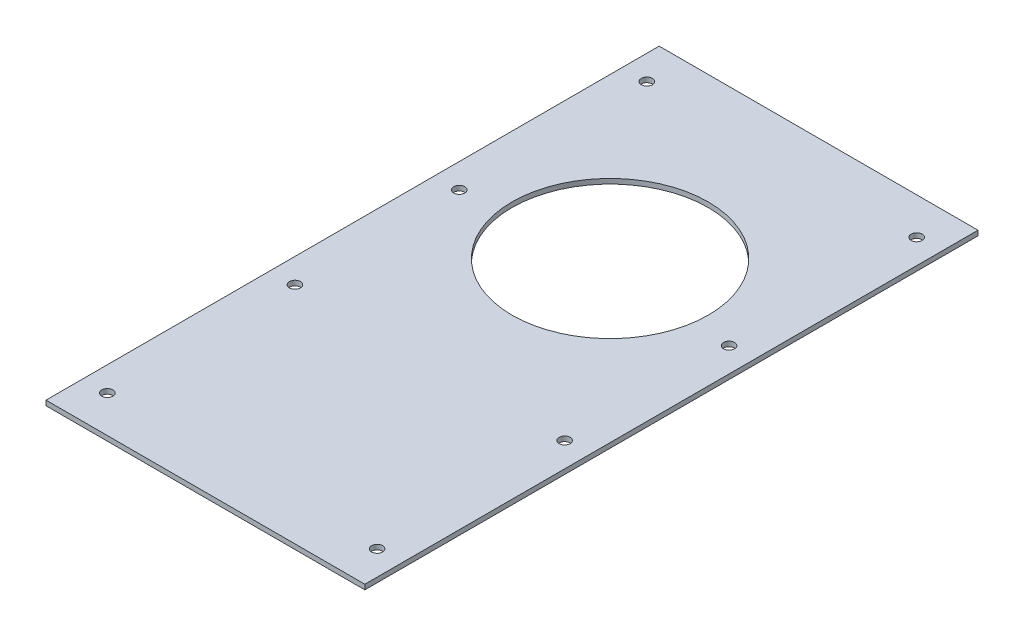
ISO-10303-21;
HEADER;
FILE_DESCRIPTION(('STEP AP214'),'2;1');
FILE_NAME('part.step','',(''),(''),'','','');
FILE_SCHEMA(('AUTOMOTIVE_DESIGN { 1 0 10303 214 1 1 1 1 }'));
ENDSEC;
DATA;
#1=APPLICATION_CONTEXT('core data for automotive mechanical design processes');
#2=APPLICATION_PROTOCOL_DEFINITION('international standard','automotive_design',2000,#1);
#3=PRODUCT_CONTEXT('',#1,'mechanical');
#4=PRODUCT('Part','Part','',(#3));
#5=PRODUCT_RELATED_PRODUCT_CATEGORY('part','',(#4));
#6=PRODUCT_DEFINITION_FORMATION('','',#4);
#7=PRODUCT_DEFINITION_CONTEXT('part definition',#1,'design');
#8=PRODUCT_DEFINITION('design','',#6,#7);
#9=PRODUCT_DEFINITION_SHAPE('','',#8);
#10=(LENGTH_UNIT() NAMED_UNIT(*) SI_UNIT(.MILLI.,.METRE.));
#11=(NAMED_UNIT(*) PLANE_ANGLE_UNIT() SI_UNIT($,.RADIAN.));
#12=(NAMED_UNIT(*) SI_UNIT($,.STERADIAN.) SOLID_ANGLE_UNIT());
#13=UNCERTAINTY_MEASURE_WITH_UNIT(LENGTH_MEASURE(1.E-05),#10,'distance_accuracy_value','');
#14=(GEOMETRIC_REPRESENTATION_CONTEXT(3) GLOBAL_UNCERTAINTY_ASSIGNED_CONTEXT((#13)) GLOBAL_UNIT_ASSIGNED_CONTEXT((#10,
#11,#12)) REPRESENTATION_CONTEXT('',''));
#15=CARTESIAN_POINT('',(0.,0.,0.));
#16=DIRECTION('',(0.,0.,1.));
#17=DIRECTION('',(1.,0.,0.));
#18=AXIS2_PLACEMENT_3D('',#15,#16,#17);
#19=CARTESIAN_POINT('',(0.,2.,0.));
#20=DIRECTION('',(0.,1.,0.));
#21=DIRECTION('',(0.,0.,1.));
#22=AXIS2_PLACEMENT_3D('',#19,#20,#21);
#23=PLANE('',#22);
#24=CARTESIAN_POINT('',(55.,2.,110.));
#25=DIRECTION('',(0.,1.,0.));
#26=DIRECTION('',(0.,0.,1.));
#27=AXIS2_PLACEMENT_3D('',#24,#25,#26);
#28=CIRCLE('',#27,2.24999999999999);
#29=CARTESIAN_POINT('',(55.,2.,112.25));
#30=VERTEX_POINT('',#29);
#31=EDGE_CURVE('E164',#30,#30,#28,.T.);
#32=ORIENTED_EDGE('',*,*,#31,.F.);
#33=EDGE_LOOP('',(#32));
#34=FACE_BOUND('',#33,.T.);
#35=CARTESIAN_POINT('',(55.,2.,33.5));
#36=DIRECTION('',(0.,1.,0.));
#37=DIRECTION('',(0.,0.,1.));
#38=AXIS2_PLACEMENT_3D('',#35,#36,#37);
#39=CIRCLE('',#38,2.24999999999999);
#40=CARTESIAN_POINT('',(55.,2.,35.75));
#41=VERTEX_POINT('',#40);
#42=EDGE_CURVE('E158',#41,#41,#39,.T.);
#43=ORIENTED_EDGE('',*,*,#42,.F.);
#44=EDGE_LOOP('',(#43));
#45=FACE_BOUND('',#44,.T.);
#46=CARTESIAN_POINT('',(55.,2.,-110.));
#47=DIRECTION('',(0.,1.,0.));
#48=DIRECTION('',(0.,0.,1.));
#49=AXIS2_PLACEMENT_3D('',#46,#47,#48);
#50=CIRCLE('',#49,2.24999999999999);
#51=CARTESIAN_POINT('',(55.,2.,-107.75));
#52=VERTEX_POINT('',#51);
#53=EDGE_CURVE('E152',#52,#52,#50,.T.);
#54=ORIENTED_EDGE('',*,*,#53,.F.);
#55=EDGE_LOOP('',(#54));
#56=FACE_BOUND('',#55,.T.);
#57=CARTESIAN_POINT('',(55.,2.,-33.5));
#58=DIRECTION('',(0.,1.,0.));
#59=DIRECTION('',(0.,0.,1.));
#60=AXIS2_PLACEMENT_3D('',#57,#58,#59);
#61=CIRCLE('',#60,2.24999999999999);
#62=CARTESIAN_POINT('',(55.,2.,-31.25));
#63=VERTEX_POINT('',#62);
#64=EDGE_CURVE('E146',#63,#63,#61,.T.);
#65=ORIENTED_EDGE('',*,*,#64,.F.);
#66=EDGE_LOOP('',(#65));
#67=FACE_BOUND('',#66,.T.);
#68=CARTESIAN_POINT('',(-55.,2.,-110.));
#69=DIRECTION('',(0.,1.,0.));
#70=DIRECTION('',(0.,0.,1.));
#71=AXIS2_PLACEMENT_3D('',#68,#69,#70);
#72=CIRCLE('',#71,2.24999999999999);
#73=CARTESIAN_POINT('',(-55.,2.,-107.75));
#74=VERTEX_POINT('',#73);
#75=EDGE_CURVE('E140',#74,#74,#72,.T.);
#76=ORIENTED_EDGE('',*,*,#75,.F.);
#77=EDGE_LOOP('',(#76));
#78=FACE_BOUND('',#77,.T.);
#79=CARTESIAN_POINT('',(-55.,2.,-33.5));
#80=DIRECTION('',(0.,1.,0.));
#81=DIRECTION('',(0.,0.,1.));
#82=AXIS2_PLACEMENT_3D('',#79,#80,#81);
#83=CIRCLE('',#82,2.24999999999999);
#84=CARTESIAN_POINT('',(-55.,2.,-31.25));
#85=VERTEX_POINT('',#84);
#86=EDGE_CURVE('E134',#85,#85,#83,.T.);
#87=ORIENTED_EDGE('',*,*,#86,.F.);
#88=EDGE_LOOP('',(#87));
#89=FACE_BOUND('',#88,.T.);
#90=CARTESIAN_POINT('',(-55.,2.,110.));
#91=DIRECTION('',(0.,1.,0.));
#92=DIRECTION('',(0.,0.,1.));
#93=AXIS2_PLACEMENT_3D('',#90,#91,#92);
#94=CIRCLE('',#93,2.24999999999999);
#95=CARTESIAN_POINT('',(-55.,2.,112.25));
#96=VERTEX_POINT('',#95);
#97=EDGE_CURVE('E128',#96,#96,#94,.T.);
#98=ORIENTED_EDGE('',*,*,#97,.F.);
#99=EDGE_LOOP('',(#98));
#100=FACE_BOUND('',#99,.T.);
#101=CARTESIAN_POINT('',(-55.,2.,33.5));
#102=DIRECTION('',(0.,1.,0.));
#103=DIRECTION('',(0.,0.,1.));
#104=AXIS2_PLACEMENT_3D('',#101,#102,#103);
#105=CIRCLE('',#104,2.24999999999999);
#106=CARTESIAN_POINT('',(-55.,2.,35.75));
#107=VERTEX_POINT('',#106);
#108=EDGE_CURVE('E122',#107,#107,#105,.T.);
#109=ORIENTED_EDGE('',*,*,#108,.F.);
#110=EDGE_LOOP('',(#109));
#111=FACE_BOUND('',#110,.T.);
#112=DIRECTION('',(0.,0.,-1.));
#113=VECTOR('',#112,1.);
#114=CARTESIAN_POINT('',(65.,2.,-125.));
#115=LINE('',#114,#113);
#116=CARTESIAN_POINT('',(65.,2.,125.));
#117=VERTEX_POINT('',#116);
#118=CARTESIAN_POINT('',(65.,2.,-125.));
#119=VERTEX_POINT('',#118);
#120=EDGE_CURVE('E87',#117,#119,#115,.T.);
#121=ORIENTED_EDGE('',*,*,#120,.T.);
#122=DIRECTION('',(-1.,0.,0.));
#123=VECTOR('',#122,1.);
#124=CARTESIAN_POINT('',(-65.,2.,-125.));
#125=LINE('',#124,#123);
#126=CARTESIAN_POINT('',(-65.,2.,-125.));
#127=VERTEX_POINT('',#126);
#128=EDGE_CURVE('E82',#119,#127,#125,.T.);
#129=ORIENTED_EDGE('',*,*,#128,.T.);
#130=DIRECTION('',(0.,0.,1.));
#131=VECTOR('',#130,1.);
#132=CARTESIAN_POINT('',(-65.,2.,-125.));
#133=LINE('',#132,#131);
#134=CARTESIAN_POINT('',(-65.,2.,125.));
#135=VERTEX_POINT('',#134);
#136=EDGE_CURVE('E85',#127,#135,#133,.T.);
#137=ORIENTED_EDGE('',*,*,#136,.T.);
#138=DIRECTION('',(1.,0.,0.));
#139=VECTOR('',#138,1.);
#140=CARTESIAN_POINT('',(-65.,2.,125.));
#141=LINE('',#140,#139);
#142=EDGE_CURVE('E52',#135,#117,#141,.T.);
#143=ORIENTED_EDGE('',*,*,#142,.T.);
#144=EDGE_LOOP('',(#121,#129,#137,#143));
#145=FACE_BOUND('',#144,.T.);
#146=CARTESIAN_POINT('',(0.,2.,-40.));
#147=DIRECTION('',(0.,1.,0.));
#148=DIRECTION('',(0.,0.,1.));
#149=AXIS2_PLACEMENT_3D('',#146,#147,#148);
#150=CIRCLE('',#149,40.);
#151=CARTESIAN_POINT('',(0.,2.,0.));
#152=VERTEX_POINT('',#151);
#153=EDGE_CURVE('E102',#152,#152,#150,.T.);
#154=ORIENTED_EDGE('',*,*,#153,.F.);
#155=EDGE_LOOP('',(#154));
#156=FACE_BOUND('',#155,.T.);
#157=ADVANCED_FACE('F35',(#34,#45,#56,#67,#78,#89,#100,#111,#145,#156),#23,.T.);
#158=CARTESIAN_POINT('',(0.,0.,0.));
#159=DIRECTION('',(0.,1.,0.));
#160=DIRECTION('',(0.,0.,1.));
#161=AXIS2_PLACEMENT_3D('',#158,#159,#160);
#162=PLANE('',#161);
#163=CARTESIAN_POINT('',(55.,0.,110.));
#164=DIRECTION('',(0.,1.,0.));
#165=DIRECTION('',(0.,0.,1.));
#166=AXIS2_PLACEMENT_3D('',#163,#164,#165);
#167=CIRCLE('',#166,2.25);
#168=CARTESIAN_POINT('',(55.,0.,112.25));
#169=VERTEX_POINT('',#168);
#170=EDGE_CURVE('E161',#169,#169,#167,.T.);
#171=ORIENTED_EDGE('',*,*,#170,.T.);
#172=EDGE_LOOP('',(#171));
#173=FACE_BOUND('',#172,.T.);
#174=CARTESIAN_POINT('',(55.,0.,33.5));
#175=DIRECTION('',(0.,1.,0.));
#176=DIRECTION('',(0.,0.,1.));
#177=AXIS2_PLACEMENT_3D('',#174,#175,#176);
#178=CIRCLE('',#177,2.25);
#179=CARTESIAN_POINT('',(55.,0.,35.75));
#180=VERTEX_POINT('',#179);
#181=EDGE_CURVE('E155',#180,#180,#178,.T.);
#182=ORIENTED_EDGE('',*,*,#181,.T.);
#183=EDGE_LOOP('',(#182));
#184=FACE_BOUND('',#183,.T.);
#185=CARTESIAN_POINT('',(55.,0.,-110.));
#186=DIRECTION('',(0.,1.,0.));
#187=DIRECTION('',(0.,0.,1.));
#188=AXIS2_PLACEMENT_3D('',#185,#186,#187);
#189=CIRCLE('',#188,2.25);
#190=CARTESIAN_POINT('',(55.,0.,-107.75));
#191=VERTEX_POINT('',#190);
#192=EDGE_CURVE('E149',#191,#191,#189,.T.);
#193=ORIENTED_EDGE('',*,*,#192,.T.);
#194=EDGE_LOOP('',(#193));
#195=FACE_BOUND('',#194,.T.);
#196=CARTESIAN_POINT('',(55.,0.,-33.5));
#197=DIRECTION('',(0.,1.,0.));
#198=DIRECTION('',(0.,0.,1.));
#199=AXIS2_PLACEMENT_3D('',#196,#197,#198);
#200=CIRCLE('',#199,2.25);
#201=CARTESIAN_POINT('',(55.,0.,-31.25));
#202=VERTEX_POINT('',#201);
#203=EDGE_CURVE('E143',#202,#202,#200,.T.);
#204=ORIENTED_EDGE('',*,*,#203,.T.);
#205=EDGE_LOOP('',(#204));
#206=FACE_BOUND('',#205,.T.);
#207=CARTESIAN_POINT('',(-55.,0.,-110.));
#208=DIRECTION('',(0.,1.,0.));
#209=DIRECTION('',(0.,0.,1.));
#210=AXIS2_PLACEMENT_3D('',#207,#208,#209);
#211=CIRCLE('',#210,2.25);
#212=CARTESIAN_POINT('',(-55.,0.,-107.75));
#213=VERTEX_POINT('',#212);
#214=EDGE_CURVE('E137',#213,#213,#211,.T.);
#215=ORIENTED_EDGE('',*,*,#214,.T.);
#216=EDGE_LOOP('',(#215));
#217=FACE_BOUND('',#216,.T.);
#218=CARTESIAN_POINT('',(-55.,0.,-33.5));
#219=DIRECTION('',(0.,1.,0.));
#220=DIRECTION('',(0.,0.,1.));
#221=AXIS2_PLACEMENT_3D('',#218,#219,#220);
#222=CIRCLE('',#221,2.25);
#223=CARTESIAN_POINT('',(-55.,0.,-31.25));
#224=VERTEX_POINT('',#223);
#225=EDGE_CURVE('E131',#224,#224,#222,.T.);
#226=ORIENTED_EDGE('',*,*,#225,.T.);
#227=EDGE_LOOP('',(#226));
#228=FACE_BOUND('',#227,.T.);
#229=CARTESIAN_POINT('',(-55.,0.,110.));
#230=DIRECTION('',(0.,1.,0.));
#231=DIRECTION('',(0.,0.,1.));
#232=AXIS2_PLACEMENT_3D('',#229,#230,#231);
#233=CIRCLE('',#232,2.25);
#234=CARTESIAN_POINT('',(-55.,0.,112.25));
#235=VERTEX_POINT('',#234);
#236=EDGE_CURVE('E125',#235,#235,#233,.T.);
#237=ORIENTED_EDGE('',*,*,#236,.T.);
#238=EDGE_LOOP('',(#237));
#239=FACE_BOUND('',#238,.T.);
#240=CARTESIAN_POINT('',(-55.,0.,33.5));
#241=DIRECTION('',(0.,1.,0.));
#242=DIRECTION('',(0.,0.,1.));
#243=AXIS2_PLACEMENT_3D('',#240,#241,#242);
#244=CIRCLE('',#243,2.25);
#245=CARTESIAN_POINT('',(-55.,0.,35.75));
#246=VERTEX_POINT('',#245);
#247=EDGE_CURVE('E117',#246,#246,#244,.T.);
#248=ORIENTED_EDGE('',*,*,#247,.T.);
#249=EDGE_LOOP('',(#248));
#250=FACE_BOUND('',#249,.T.);
#251=DIRECTION('',(0.,0.,-1.));
#252=VECTOR('',#251,1.);
#253=CARTESIAN_POINT('',(65.,0.,-125.));
#254=LINE('',#253,#252);
#255=CARTESIAN_POINT('',(65.,0.,125.));
#256=VERTEX_POINT('',#255);
#257=CARTESIAN_POINT('',(65.,0.,-125.));
#258=VERTEX_POINT('',#257);
#259=EDGE_CURVE('E99',#256,#258,#254,.T.);
#260=ORIENTED_EDGE('',*,*,#259,.F.);
#261=DIRECTION('',(1.,0.,0.));
#262=VECTOR('',#261,1.);
#263=CARTESIAN_POINT('',(-65.,0.,125.));
#264=LINE('',#263,#262);
#265=CARTESIAN_POINT('',(-65.,0.,125.));
#266=VERTEX_POINT('',#265);
#267=EDGE_CURVE('E75',#266,#256,#264,.T.);
#268=ORIENTED_EDGE('',*,*,#267,.F.);
#269=DIRECTION('',(0.,0.,1.));
#270=VECTOR('',#269,1.);
#271=CARTESIAN_POINT('',(-65.,0.,-125.));
#272=LINE('',#271,#270);
#273=CARTESIAN_POINT('',(-65.,0.,-125.));
#274=VERTEX_POINT('',#273);
#275=EDGE_CURVE('E69',#274,#266,#272,.T.);
#276=ORIENTED_EDGE('',*,*,#275,.F.);
#277=DIRECTION('',(-1.,0.,0.));
#278=VECTOR('',#277,1.);
#279=CARTESIAN_POINT('',(-65.,0.,-125.));
#280=LINE('',#279,#278);
#281=EDGE_CURVE('E91',#258,#274,#280,.T.);
#282=ORIENTED_EDGE('',*,*,#281,.F.);
#283=EDGE_LOOP('',(#260,#268,#276,#282));
#284=FACE_BOUND('',#283,.T.);
#285=CARTESIAN_POINT('',(0.,0.,-40.));
#286=DIRECTION('',(0.,1.,0.));
#287=DIRECTION('',(0.,0.,1.));
#288=AXIS2_PLACEMENT_3D('',#285,#286,#287);
#289=CIRCLE('',#288,40.);
#290=CARTESIAN_POINT('',(0.,0.,0.));
#291=VERTEX_POINT('',#290);
#292=EDGE_CURVE('E114',#291,#291,#289,.T.);
#293=ORIENTED_EDGE('',*,*,#292,.T.);
#294=EDGE_LOOP('',(#293));
#295=FACE_BOUND('',#294,.T.);
#296=ADVANCED_FACE('F110',(#173,#184,#195,#206,#217,#228,#239,#250,#284,#295),#162,.F.);
#297=CARTESIAN_POINT('',(65.,2.,-125.));
#298=DIRECTION('',(-1.,0.,0.));
#299=DIRECTION('',(0.,0.,1.));
#300=AXIS2_PLACEMENT_3D('',#297,#298,#299);
#301=PLANE('',#300);
#302=ORIENTED_EDGE('',*,*,#259,.T.);
#303=DIRECTION('',(0.,-1.,0.));
#304=VECTOR('',#303,1.);
#305=CARTESIAN_POINT('',(65.,2.,-125.));
#306=LINE('',#305,#304);
#307=EDGE_CURVE('E11',#119,#258,#306,.T.);
#308=ORIENTED_EDGE('',*,*,#307,.F.);
#309=ORIENTED_EDGE('',*,*,#120,.F.);
#310=DIRECTION('',(0.,-1.,0.));
#311=VECTOR('',#310,1.);
#312=CARTESIAN_POINT('',(65.,2.,125.));
#313=LINE('',#312,#311);
#314=EDGE_CURVE('E95',#117,#256,#313,.T.);
#315=ORIENTED_EDGE('',*,*,#314,.T.);
#316=EDGE_LOOP('',(#302,#308,#309,#315));
#317=FACE_BOUND('',#316,.T.);
#318=ADVANCED_FACE('F37',(#317),#301,.F.);
#319=CARTESIAN_POINT('',(-65.,2.,-125.));
#320=DIRECTION('',(0.,0.,1.));
#321=DIRECTION('',(1.,0.,0.));
#322=AXIS2_PLACEMENT_3D('',#319,#320,#321);
#323=PLANE('',#322);
#324=ORIENTED_EDGE('',*,*,#281,.T.);
#325=DIRECTION('',(0.,-1.,0.));
#326=VECTOR('',#325,1.);
#327=CARTESIAN_POINT('',(-65.,2.,-125.));
#328=LINE('',#327,#326);
#329=EDGE_CURVE('E44',#127,#274,#328,.T.);
#330=ORIENTED_EDGE('',*,*,#329,.F.);
#331=ORIENTED_EDGE('',*,*,#128,.F.);
#332=ORIENTED_EDGE('',*,*,#307,.T.);
#333=EDGE_LOOP('',(#324,#330,#331,#332));
#334=FACE_BOUND('',#333,.T.);
#335=ADVANCED_FACE('F90',(#334),#323,.F.);
#336=CARTESIAN_POINT('',(-65.,2.,-125.));
#337=DIRECTION('',(1.,0.,0.));
#338=DIRECTION('',(0.,0.,-1.));
#339=AXIS2_PLACEMENT_3D('',#336,#337,#338);
#340=PLANE('',#339);
#341=ORIENTED_EDGE('',*,*,#275,.T.);
#342=DIRECTION('',(0.,-1.,0.));
#343=VECTOR('',#342,1.);
#344=CARTESIAN_POINT('',(-65.,2.,125.));
#345=LINE('',#344,#343);
#346=EDGE_CURVE('E92',#135,#266,#345,.T.);
#347=ORIENTED_EDGE('',*,*,#346,.F.);
#348=ORIENTED_EDGE('',*,*,#136,.F.);
#349=ORIENTED_EDGE('',*,*,#329,.T.);
#350=EDGE_LOOP('',(#341,#347,#348,#349));
#351=FACE_BOUND('',#350,.T.);
#352=ADVANCED_FACE('F93',(#351),#340,.F.);
#353=CARTESIAN_POINT('',(-65.,2.,125.));
#354=DIRECTION('',(0.,0.,-1.));
#355=DIRECTION('',(-1.,0.,0.));
#356=AXIS2_PLACEMENT_3D('',#353,#354,#355);
#357=PLANE('',#356);
#358=ORIENTED_EDGE('',*,*,#267,.T.);
#359=ORIENTED_EDGE('',*,*,#314,.F.);
#360=ORIENTED_EDGE('',*,*,#142,.F.);
#361=ORIENTED_EDGE('',*,*,#346,.T.);
#362=EDGE_LOOP('',(#358,#359,#360,#361));
#363=FACE_BOUND('',#362,.T.);
#364=ADVANCED_FACE('F107',(#363),#357,.F.);
#365=CARTESIAN_POINT('',(0.,2.,-40.));
#366=DIRECTION('',(0.,-1.,0.));
#367=DIRECTION('',(0.,0.,-1.));
#368=AXIS2_PLACEMENT_3D('',#365,#366,#367);
#369=CYLINDRICAL_SURFACE('',#368,40.);
#370=ORIENTED_EDGE('',*,*,#153,.T.);
#371=EDGE_LOOP('',(#370));
#372=FACE_BOUND('',#371,.T.);
#373=ORIENTED_EDGE('',*,*,#292,.F.);
#374=EDGE_LOOP('',(#373));
#375=FACE_BOUND('',#374,.T.);
#376=ADVANCED_FACE('F190',(#372,#375),#369,.F.);
#377=CARTESIAN_POINT('',(-55.,2.,33.5));
#378=DIRECTION('',(0.,1.,0.));
#379=DIRECTION('',(0.,0.,1.));
#380=AXIS2_PLACEMENT_3D('',#377,#378,#379);
#381=CYLINDRICAL_SURFACE('',#380,2.24999999999999);
#382=ORIENTED_EDGE('',*,*,#247,.F.);
#383=EDGE_LOOP('',(#382));
#384=FACE_BOUND('',#383,.T.);
#385=ORIENTED_EDGE('',*,*,#108,.T.);
#386=EDGE_LOOP('',(#385));
#387=FACE_BOUND('',#386,.T.);
#388=ADVANCED_FACE('F187',(#384,#387),#381,.F.);
#389=CARTESIAN_POINT('',(-55.,2.,110.));
#390=DIRECTION('',(0.,1.,0.));
#391=DIRECTION('',(0.,0.,1.));
#392=AXIS2_PLACEMENT_3D('',#389,#390,#391);
#393=CYLINDRICAL_SURFACE('',#392,2.24999999999999);
#394=ORIENTED_EDGE('',*,*,#236,.F.);
#395=EDGE_LOOP('',(#394));
#396=FACE_BOUND('',#395,.T.);
#397=ORIENTED_EDGE('',*,*,#97,.T.);
#398=EDGE_LOOP('',(#397));
#399=FACE_BOUND('',#398,.T.);
#400=ADVANCED_FACE('F189',(#396,#399),#393,.F.);
#401=CARTESIAN_POINT('',(-55.,2.,-33.5));
#402=DIRECTION('',(0.,1.,0.));
#403=DIRECTION('',(0.,0.,1.));
#404=AXIS2_PLACEMENT_3D('',#401,#402,#403);
#405=CYLINDRICAL_SURFACE('',#404,2.24999999999999);
#406=ORIENTED_EDGE('',*,*,#225,.F.);
#407=EDGE_LOOP('',(#406));
#408=FACE_BOUND('',#407,.T.);
#409=ORIENTED_EDGE('',*,*,#86,.T.);
#410=EDGE_LOOP('',(#409));
#411=FACE_BOUND('',#410,.T.);
#412=ADVANCED_FACE('F197',(#408,#411),#405,.F.);
#413=CARTESIAN_POINT('',(-55.,2.,-110.));
#414=DIRECTION('',(0.,1.,0.));
#415=DIRECTION('',(0.,0.,1.));
#416=AXIS2_PLACEMENT_3D('',#413,#414,#415);
#417=CYLINDRICAL_SURFACE('',#416,2.24999999999999);
#418=ORIENTED_EDGE('',*,*,#214,.F.);
#419=EDGE_LOOP('',(#418));
#420=FACE_BOUND('',#419,.T.);
#421=ORIENTED_EDGE('',*,*,#75,.T.);
#422=EDGE_LOOP('',(#421));
#423=FACE_BOUND('',#422,.T.);
#424=ADVANCED_FACE('F231',(#420,#423),#417,.F.);
#425=CARTESIAN_POINT('',(55.,2.,-33.5));
#426=DIRECTION('',(0.,1.,0.));
#427=DIRECTION('',(0.,0.,1.));
#428=AXIS2_PLACEMENT_3D('',#425,#426,#427);
#429=CYLINDRICAL_SURFACE('',#428,2.24999999999999);
#430=ORIENTED_EDGE('',*,*,#203,.F.);
#431=EDGE_LOOP('',(#430));
#432=FACE_BOUND('',#431,.T.);
#433=ORIENTED_EDGE('',*,*,#64,.T.);
#434=EDGE_LOOP('',(#433));
#435=FACE_BOUND('',#434,.T.);
#436=ADVANCED_FACE('F236',(#432,#435),#429,.F.);
#437=CARTESIAN_POINT('',(55.,2.,-110.));
#438=DIRECTION('',(0.,1.,0.));
#439=DIRECTION('',(0.,0.,1.));
#440=AXIS2_PLACEMENT_3D('',#437,#438,#439);
#441=CYLINDRICAL_SURFACE('',#440,2.24999999999999);
#442=ORIENTED_EDGE('',*,*,#192,.F.);
#443=EDGE_LOOP('',(#442));
#444=FACE_BOUND('',#443,.T.);
#445=ORIENTED_EDGE('',*,*,#53,.T.);
#446=EDGE_LOOP('',(#445));
#447=FACE_BOUND('',#446,.T.);
#448=ADVANCED_FACE('F291',(#444,#447),#441,.F.);
#449=CARTESIAN_POINT('',(55.,2.,33.5));
#450=DIRECTION('',(0.,1.,0.));
#451=DIRECTION('',(0.,0.,1.));
#452=AXIS2_PLACEMENT_3D('',#449,#450,#451);
#453=CYLINDRICAL_SURFACE('',#452,2.24999999999999);
#454=ORIENTED_EDGE('',*,*,#181,.F.);
#455=EDGE_LOOP('',(#454));
#456=FACE_BOUND('',#455,.T.);
#457=ORIENTED_EDGE('',*,*,#42,.T.);
#458=EDGE_LOOP('',(#457));
#459=FACE_BOUND('',#458,.T.);
#460=ADVANCED_FACE('F295',(#456,#459),#453,.F.);
#461=CARTESIAN_POINT('',(55.,2.,110.));
#462=DIRECTION('',(0.,1.,0.));
#463=DIRECTION('',(0.,0.,1.));
#464=AXIS2_PLACEMENT_3D('',#461,#462,#463);
#465=CYLINDRICAL_SURFACE('',#464,2.24999999999999);
#466=ORIENTED_EDGE('',*,*,#170,.F.);
#467=EDGE_LOOP('',(#466));
#468=FACE_BOUND('',#467,.T.);
#469=ORIENTED_EDGE('',*,*,#31,.T.);
#470=EDGE_LOOP('',(#469));
#471=FACE_BOUND('',#470,.T.);
#472=ADVANCED_FACE('F168',(#468,#471),#465,.F.);
#473=CLOSED_SHELL('',(#157,#296,#318,#335,#352,#364,#376,#388,#400,#412,#424,#436,#448,#460,#472));
#474=MANIFOLD_SOLID_BREP('B2',#473);
#475=ADVANCED_BREP_SHAPE_REPRESENTATION('',(#18,#474),#14);
#476=SHAPE_DEFINITION_REPRESENTATION(#9,#475);
ENDSEC;
END-ISO-10303-21;
